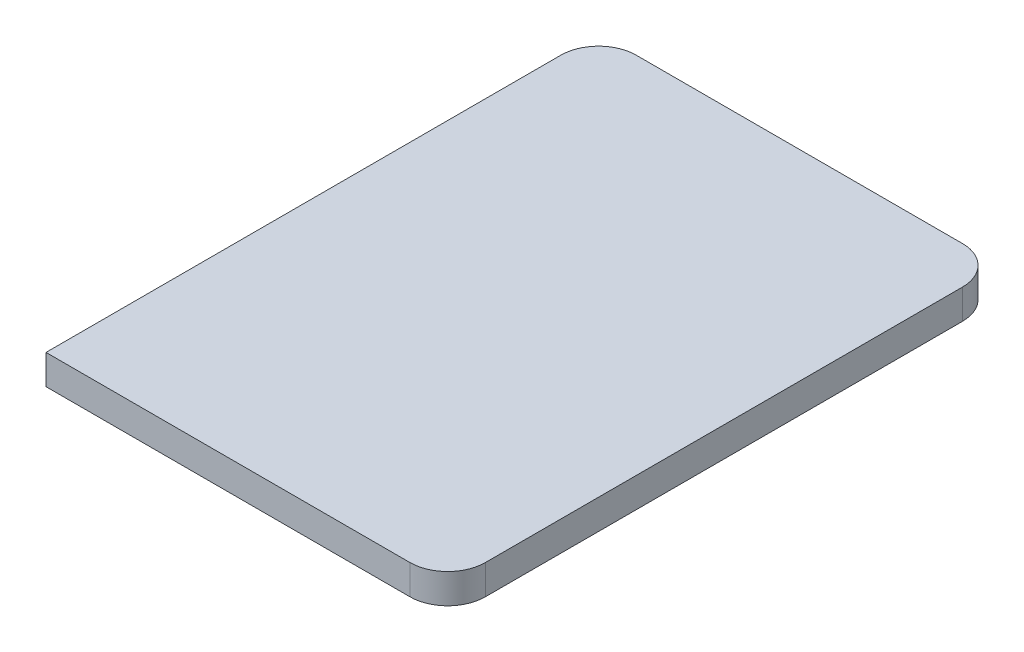
ISO-10303-21;
HEADER;
FILE_DESCRIPTION(('STEP AP214'),'2;1');
FILE_NAME('part.step','',(''),(''),'','','');
FILE_SCHEMA(('AUTOMOTIVE_DESIGN { 1 0 10303 214 1 1 1 1 }'));
ENDSEC;
DATA;
#1=APPLICATION_CONTEXT('core data for automotive mechanical design processes');
#2=APPLICATION_PROTOCOL_DEFINITION('international standard','automotive_design',2000,#1);
#3=PRODUCT_CONTEXT('',#1,'mechanical');
#4=PRODUCT('Part','Part','',(#3));
#5=PRODUCT_RELATED_PRODUCT_CATEGORY('part','',(#4));
#6=PRODUCT_DEFINITION_FORMATION('','',#4);
#7=PRODUCT_DEFINITION_CONTEXT('part definition',#1,'design');
#8=PRODUCT_DEFINITION('design','',#6,#7);
#9=PRODUCT_DEFINITION_SHAPE('','',#8);
#10=(LENGTH_UNIT() NAMED_UNIT(*) SI_UNIT(.MILLI.,.METRE.));
#11=(NAMED_UNIT(*) PLANE_ANGLE_UNIT() SI_UNIT($,.RADIAN.));
#12=(NAMED_UNIT(*) SI_UNIT($,.STERADIAN.) SOLID_ANGLE_UNIT());
#13=UNCERTAINTY_MEASURE_WITH_UNIT(LENGTH_MEASURE(1.E-05),#10,'distance_accuracy_value','');
#14=(GEOMETRIC_REPRESENTATION_CONTEXT(3) GLOBAL_UNCERTAINTY_ASSIGNED_CONTEXT((#13)) GLOBAL_UNIT_ASSIGNED_CONTEXT((#10,
#11,#12)) REPRESENTATION_CONTEXT('',''));
#15=CARTESIAN_POINT('',(0.,0.,0.));
#16=DIRECTION('',(0.,0.,1.));
#17=DIRECTION('',(1.,0.,0.));
#18=AXIS2_PLACEMENT_3D('',#15,#16,#17);
#19=CARTESIAN_POINT('',(19.3,1.575,-2.));
#20=DIRECTION('',(0.,-1.,0.));
#21=DIRECTION('',(0.,0.,-1.));
#22=AXIS2_PLACEMENT_3D('',#19,#20,#21);
#23=CYLINDRICAL_SURFACE('',#22,2.);
#24=CARTESIAN_POINT('',(19.3,0.,-2.));
#25=DIRECTION('',(0.,1.,0.));
#26=DIRECTION('',(0.,0.,1.));
#27=AXIS2_PLACEMENT_3D('',#24,#25,#26);
#28=CIRCLE('',#27,2.);
#29=CARTESIAN_POINT('',(19.3,0.,0.));
#30=VERTEX_POINT('',#29);
#31=CARTESIAN_POINT('',(21.3,0.,-2.00000000000001));
#32=VERTEX_POINT('',#31);
#33=EDGE_CURVE('E124',#30,#32,#28,.T.);
#34=ORIENTED_EDGE('',*,*,#33,.T.);
#35=DIRECTION('',(0.,-1.,0.));
#36=VECTOR('',#35,1.);
#37=CARTESIAN_POINT('',(21.3,1.575,-2.00000000000001));
#38=LINE('',#37,#36);
#39=CARTESIAN_POINT('',(21.3,1.575,-2.00000000000001));
#40=VERTEX_POINT('',#39);
#41=EDGE_CURVE('E11',#40,#32,#38,.T.);
#42=ORIENTED_EDGE('',*,*,#41,.F.);
#43=CARTESIAN_POINT('',(19.3,1.575,-2.));
#44=DIRECTION('',(0.,1.,0.));
#45=DIRECTION('',(0.,0.,1.));
#46=AXIS2_PLACEMENT_3D('',#43,#44,#45);
#47=CIRCLE('',#46,2.);
#48=CARTESIAN_POINT('',(19.3,1.575,0.));
#49=VERTEX_POINT('',#48);
#50=EDGE_CURVE('E137',#49,#40,#47,.T.);
#51=ORIENTED_EDGE('',*,*,#50,.F.);
#52=DIRECTION('',(0.,-1.,0.));
#53=VECTOR('',#52,1.);
#54=CARTESIAN_POINT('',(19.3,1.575,0.));
#55=LINE('',#54,#53);
#56=EDGE_CURVE('E120',#49,#30,#55,.T.);
#57=ORIENTED_EDGE('',*,*,#56,.T.);
#58=EDGE_LOOP('',(#34,#42,#51,#57));
#59=FACE_BOUND('',#58,.T.);
#60=ADVANCED_FACE('F33',(#59),#23,.T.);
#61=CARTESIAN_POINT('',(21.3,1.575,-2.00000000000001));
#62=DIRECTION('',(-1.,0.,0.));
#63=DIRECTION('',(0.,0.,1.));
#64=AXIS2_PLACEMENT_3D('',#61,#62,#63);
#65=PLANE('',#64);
#66=DIRECTION('',(0.,0.,-1.));
#67=VECTOR('',#66,1.);
#68=CARTESIAN_POINT('',(21.3,0.,-2.00000000000001));
#69=LINE('',#68,#67);
#70=CARTESIAN_POINT('',(21.3,0.,-27.3));
#71=VERTEX_POINT('',#70);
#72=EDGE_CURVE('E127',#32,#71,#69,.T.);
#73=ORIENTED_EDGE('',*,*,#72,.T.);
#74=DIRECTION('',(0.,-1.,0.));
#75=VECTOR('',#74,1.);
#76=CARTESIAN_POINT('',(21.3,1.575,-27.3));
#77=LINE('',#76,#75);
#78=CARTESIAN_POINT('',(21.3,1.575,-27.3));
#79=VERTEX_POINT('',#78);
#80=EDGE_CURVE('E41',#79,#71,#77,.T.);
#81=ORIENTED_EDGE('',*,*,#80,.F.);
#82=DIRECTION('',(0.,0.,-1.));
#83=VECTOR('',#82,1.);
#84=CARTESIAN_POINT('',(21.3,1.575,-2.00000000000001));
#85=LINE('',#84,#83);
#86=EDGE_CURVE('E86',#40,#79,#85,.T.);
#87=ORIENTED_EDGE('',*,*,#86,.F.);
#88=ORIENTED_EDGE('',*,*,#41,.T.);
#89=EDGE_LOOP('',(#73,#81,#87,#88));
#90=FACE_BOUND('',#89,.T.);
#91=ADVANCED_FACE('F160',(#90),#65,.F.);
#92=CARTESIAN_POINT('',(19.3,1.575,-27.3));
#93=DIRECTION('',(0.,-1.,0.));
#94=DIRECTION('',(0.,0.,-1.));
#95=AXIS2_PLACEMENT_3D('',#92,#93,#94);
#96=CYLINDRICAL_SURFACE('',#95,2.);
#97=CARTESIAN_POINT('',(19.3,0.,-27.3));
#98=DIRECTION('',(0.,1.,0.));
#99=DIRECTION('',(0.,0.,-1.));
#100=AXIS2_PLACEMENT_3D('',#97,#98,#99);
#101=CIRCLE('',#100,2.);
#102=CARTESIAN_POINT('',(19.3,0.,-29.3));
#103=VERTEX_POINT('',#102);
#104=EDGE_CURVE('E129',#71,#103,#101,.T.);
#105=ORIENTED_EDGE('',*,*,#104,.T.);
#106=DIRECTION('',(0.,-1.,0.));
#107=VECTOR('',#106,1.);
#108=CARTESIAN_POINT('',(19.3,1.575,-29.3));
#109=LINE('',#108,#107);
#110=CARTESIAN_POINT('',(19.3,1.575,-29.3));
#111=VERTEX_POINT('',#110);
#112=EDGE_CURVE('E141',#111,#103,#109,.T.);
#113=ORIENTED_EDGE('',*,*,#112,.F.);
#114=CARTESIAN_POINT('',(19.3,1.575,-27.3));
#115=DIRECTION('',(0.,1.,0.));
#116=DIRECTION('',(0.,0.,-1.));
#117=AXIS2_PLACEMENT_3D('',#114,#115,#116);
#118=CIRCLE('',#117,2.);
#119=EDGE_CURVE('E149',#79,#111,#118,.T.);
#120=ORIENTED_EDGE('',*,*,#119,.F.);
#121=ORIENTED_EDGE('',*,*,#80,.T.);
#122=EDGE_LOOP('',(#105,#113,#120,#121));
#123=FACE_BOUND('',#122,.T.);
#124=ADVANCED_FACE('F147',(#123),#96,.T.);
#125=CARTESIAN_POINT('',(2.,1.575,-29.3));
#126=DIRECTION('',(0.,0.,1.));
#127=DIRECTION('',(1.,0.,0.));
#128=AXIS2_PLACEMENT_3D('',#125,#126,#127);
#129=PLANE('',#128);
#130=DIRECTION('',(-1.,0.,0.));
#131=VECTOR('',#130,1.);
#132=CARTESIAN_POINT('',(2.,0.,-29.3));
#133=LINE('',#132,#131);
#134=CARTESIAN_POINT('',(2.,0.,-29.3));
#135=VERTEX_POINT('',#134);
#136=EDGE_CURVE('E131',#103,#135,#133,.T.);
#137=ORIENTED_EDGE('',*,*,#136,.T.);
#138=DIRECTION('',(0.,-1.,0.));
#139=VECTOR('',#138,1.);
#140=CARTESIAN_POINT('',(2.,1.575,-29.3));
#141=LINE('',#140,#139);
#142=CARTESIAN_POINT('',(2.,1.575,-29.3));
#143=VERTEX_POINT('',#142);
#144=EDGE_CURVE('E115',#143,#135,#141,.T.);
#145=ORIENTED_EDGE('',*,*,#144,.F.);
#146=DIRECTION('',(-1.,0.,0.));
#147=VECTOR('',#146,1.);
#148=CARTESIAN_POINT('',(2.,1.575,-29.3));
#149=LINE('',#148,#147);
#150=EDGE_CURVE('E103',#111,#143,#149,.T.);
#151=ORIENTED_EDGE('',*,*,#150,.F.);
#152=ORIENTED_EDGE('',*,*,#112,.T.);
#153=EDGE_LOOP('',(#137,#145,#151,#152));
#154=FACE_BOUND('',#153,.T.);
#155=ADVANCED_FACE('F153',(#154),#129,.F.);
#156=CARTESIAN_POINT('',(2.,1.575,-27.3));
#157=DIRECTION('',(0.,-1.,0.));
#158=DIRECTION('',(0.,0.,-1.));
#159=AXIS2_PLACEMENT_3D('',#156,#157,#158);
#160=CYLINDRICAL_SURFACE('',#159,2.);
#161=CARTESIAN_POINT('',(2.,0.,-27.3));
#162=DIRECTION('',(0.,1.,0.));
#163=DIRECTION('',(0.,0.,-1.));
#164=AXIS2_PLACEMENT_3D('',#161,#162,#163);
#165=CIRCLE('',#164,2.);
#166=CARTESIAN_POINT('',(0.,0.,-27.3));
#167=VERTEX_POINT('',#166);
#168=EDGE_CURVE('E113',#135,#167,#165,.T.);
#169=ORIENTED_EDGE('',*,*,#168,.T.);
#170=DIRECTION('',(0.,-1.,0.));
#171=VECTOR('',#170,1.);
#172=CARTESIAN_POINT('',(0.,1.575,-27.3));
#173=LINE('',#172,#171);
#174=CARTESIAN_POINT('',(0.,1.575,-27.3));
#175=VERTEX_POINT('',#174);
#176=EDGE_CURVE('E110',#175,#167,#173,.T.);
#177=ORIENTED_EDGE('',*,*,#176,.F.);
#178=CARTESIAN_POINT('',(2.,1.575,-27.3));
#179=DIRECTION('',(0.,1.,0.));
#180=DIRECTION('',(0.,0.,-1.));
#181=AXIS2_PLACEMENT_3D('',#178,#179,#180);
#182=CIRCLE('',#181,2.);
#183=EDGE_CURVE('E96',#143,#175,#182,.T.);
#184=ORIENTED_EDGE('',*,*,#183,.F.);
#185=ORIENTED_EDGE('',*,*,#144,.T.);
#186=EDGE_LOOP('',(#169,#177,#184,#185));
#187=FACE_BOUND('',#186,.T.);
#188=ADVANCED_FACE('F111',(#187),#160,.T.);
#189=CARTESIAN_POINT('',(0.,1.575,-2.00000000000001));
#190=DIRECTION('',(1.,0.,0.));
#191=DIRECTION('',(0.,0.,-1.));
#192=AXIS2_PLACEMENT_3D('',#189,#190,#191);
#193=PLANE('',#192);
#194=DIRECTION('',(0.,0.,1.));
#195=VECTOR('',#194,1.);
#196=CARTESIAN_POINT('',(0.,0.,-2.00000000000001));
#197=LINE('',#196,#195);
#198=CARTESIAN_POINT('',(0.,0.,0.));
#199=VERTEX_POINT('',#198);
#200=EDGE_CURVE('E134',#167,#199,#197,.T.);
#201=ORIENTED_EDGE('',*,*,#200,.T.);
#202=DIRECTION('',(0.,-1.,0.));
#203=VECTOR('',#202,1.);
#204=CARTESIAN_POINT('',(0.,1.575,0.));
#205=LINE('',#204,#203);
#206=CARTESIAN_POINT('',(0.,1.575,0.));
#207=VERTEX_POINT('',#206);
#208=EDGE_CURVE('E116',#207,#199,#205,.T.);
#209=ORIENTED_EDGE('',*,*,#208,.F.);
#210=DIRECTION('',(0.,0.,1.));
#211=VECTOR('',#210,1.);
#212=CARTESIAN_POINT('',(0.,1.575,-2.00000000000001));
#213=LINE('',#212,#211);
#214=EDGE_CURVE('E100',#175,#207,#213,.T.);
#215=ORIENTED_EDGE('',*,*,#214,.F.);
#216=ORIENTED_EDGE('',*,*,#176,.T.);
#217=EDGE_LOOP('',(#201,#209,#215,#216));
#218=FACE_BOUND('',#217,.T.);
#219=ADVANCED_FACE('F118',(#218),#193,.F.);
#220=CARTESIAN_POINT('',(2.00000000000001,1.575,0.));
#221=DIRECTION('',(0.,0.,-1.));
#222=DIRECTION('',(-1.,0.,0.));
#223=AXIS2_PLACEMENT_3D('',#220,#221,#222);
#224=PLANE('',#223);
#225=DIRECTION('',(1.,0.,0.));
#226=VECTOR('',#225,1.);
#227=CARTESIAN_POINT('',(2.00000000000001,0.,0.));
#228=LINE('',#227,#226);
#229=EDGE_CURVE('E74',#199,#30,#228,.T.);
#230=ORIENTED_EDGE('',*,*,#229,.T.);
#231=ORIENTED_EDGE('',*,*,#56,.F.);
#232=DIRECTION('',(1.,0.,0.));
#233=VECTOR('',#232,1.);
#234=CARTESIAN_POINT('',(0.,1.575,0.));
#235=LINE('',#234,#233);
#236=EDGE_CURVE('E49',#207,#49,#235,.T.);
#237=ORIENTED_EDGE('',*,*,#236,.F.);
#238=ORIENTED_EDGE('',*,*,#208,.T.);
#239=EDGE_LOOP('',(#230,#231,#237,#238));
#240=FACE_BOUND('',#239,.T.);
#241=ADVANCED_FACE('F174',(#240),#224,.F.);
#242=CARTESIAN_POINT('',(19.3,1.575,-2.));
#243=DIRECTION('',(0.,1.,0.));
#244=DIRECTION('',(0.,0.,1.));
#245=AXIS2_PLACEMENT_3D('',#242,#243,#244);
#246=PLANE('',#245);
#247=ORIENTED_EDGE('',*,*,#50,.T.);
#248=ORIENTED_EDGE('',*,*,#86,.T.);
#249=ORIENTED_EDGE('',*,*,#119,.T.);
#250=ORIENTED_EDGE('',*,*,#150,.T.);
#251=ORIENTED_EDGE('',*,*,#183,.T.);
#252=ORIENTED_EDGE('',*,*,#214,.T.);
#253=ORIENTED_EDGE('',*,*,#236,.T.);
#254=EDGE_LOOP('',(#247,#248,#249,#250,#251,#252,#253));
#255=FACE_BOUND('',#254,.T.);
#256=ADVANCED_FACE('F98',(#255),#246,.T.);
#257=CARTESIAN_POINT('',(19.3,0.,-2.));
#258=DIRECTION('',(0.,1.,0.));
#259=DIRECTION('',(0.,0.,1.));
#260=AXIS2_PLACEMENT_3D('',#257,#258,#259);
#261=PLANE('',#260);
#262=ORIENTED_EDGE('',*,*,#33,.F.);
#263=ORIENTED_EDGE('',*,*,#229,.F.);
#264=ORIENTED_EDGE('',*,*,#200,.F.);
#265=ORIENTED_EDGE('',*,*,#168,.F.);
#266=ORIENTED_EDGE('',*,*,#136,.F.);
#267=ORIENTED_EDGE('',*,*,#104,.F.);
#268=ORIENTED_EDGE('',*,*,#72,.F.);
#269=EDGE_LOOP('',(#262,#263,#264,#265,#266,#267,#268));
#270=FACE_BOUND('',#269,.T.);
#271=ADVANCED_FACE('F151',(#270),#261,.F.);
#272=CLOSED_SHELL('',(#60,#91,#124,#155,#188,#219,#241,#256,#271));
#273=MANIFOLD_SOLID_BREP('B2',#272);
#274=ADVANCED_BREP_SHAPE_REPRESENTATION('',(#18,#273),#14);
#275=SHAPE_DEFINITION_REPRESENTATION(#9,#274);
ENDSEC;
END-ISO-10303-21;
